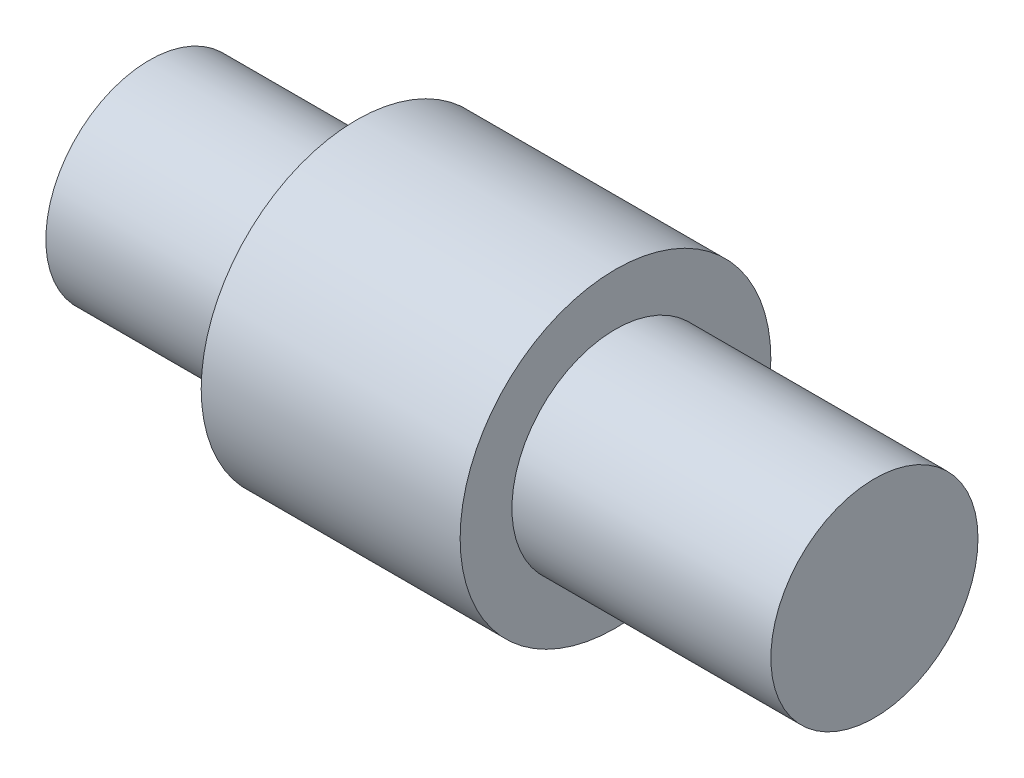
ISO-10303-21;
HEADER;
FILE_DESCRIPTION(('STEP AP214'),'2;1');
FILE_NAME('part.step','',(''),(''),'','','');
FILE_SCHEMA(('AUTOMOTIVE_DESIGN { 1 0 10303 214 1 1 1 1 }'));
ENDSEC;
DATA;
#1=APPLICATION_CONTEXT('core data for automotive mechanical design processes');
#2=APPLICATION_PROTOCOL_DEFINITION('international standard','automotive_design',2000,#1);
#3=PRODUCT_CONTEXT('',#1,'mechanical');
#4=PRODUCT('Part','Part','',(#3));
#5=PRODUCT_RELATED_PRODUCT_CATEGORY('part','',(#4));
#6=PRODUCT_DEFINITION_FORMATION('','',#4);
#7=PRODUCT_DEFINITION_CONTEXT('part definition',#1,'design');
#8=PRODUCT_DEFINITION('design','',#6,#7);
#9=PRODUCT_DEFINITION_SHAPE('','',#8);
#10=(LENGTH_UNIT() NAMED_UNIT(*) SI_UNIT(.MILLI.,.METRE.));
#11=(NAMED_UNIT(*) PLANE_ANGLE_UNIT() SI_UNIT($,.RADIAN.));
#12=(NAMED_UNIT(*) SI_UNIT($,.STERADIAN.) SOLID_ANGLE_UNIT());
#13=UNCERTAINTY_MEASURE_WITH_UNIT(LENGTH_MEASURE(1.E-05),#10,'distance_accuracy_value','');
#14=(GEOMETRIC_REPRESENTATION_CONTEXT(3) GLOBAL_UNCERTAINTY_ASSIGNED_CONTEXT((#13)) GLOBAL_UNIT_ASSIGNED_CONTEXT((#10,
#11,#12)) REPRESENTATION_CONTEXT('',''));
#15=CARTESIAN_POINT('',(0.,0.,0.));
#16=DIRECTION('',(0.,0.,1.));
#17=DIRECTION('',(1.,0.,0.));
#18=AXIS2_PLACEMENT_3D('',#15,#16,#17);
#19=CARTESIAN_POINT('',(5.,0.,0.));
#20=DIRECTION('',(-1.,0.,0.));
#21=DIRECTION('',(0.,0.,1.));
#22=AXIS2_PLACEMENT_3D('',#19,#20,#21);
#23=CYLINDRICAL_SURFACE('',#22,3.);
#24=CARTESIAN_POINT('',(5.,0.,0.));
#25=DIRECTION('',(1.,0.,0.));
#26=DIRECTION('',(0.,0.,-1.));
#27=AXIS2_PLACEMENT_3D('',#24,#25,#26);
#28=CIRCLE('',#27,3.);
#29=CARTESIAN_POINT('',(5.,0.,-3.));
#30=VERTEX_POINT('',#29);
#31=EDGE_CURVE('E38',#30,#30,#28,.T.);
#32=ORIENTED_EDGE('',*,*,#31,.F.);
#33=EDGE_LOOP('',(#32));
#34=FACE_BOUND('',#33,.T.);
#35=CARTESIAN_POINT('',(0.,0.,0.));
#36=DIRECTION('',(1.,0.,0.));
#37=DIRECTION('',(0.,0.,-1.));
#38=AXIS2_PLACEMENT_3D('',#35,#36,#37);
#39=CIRCLE('',#38,3.);
#40=CARTESIAN_POINT('',(0.,0.,-3.));
#41=VERTEX_POINT('',#40);
#42=EDGE_CURVE('E43',#41,#41,#39,.T.);
#43=ORIENTED_EDGE('',*,*,#42,.T.);
#44=EDGE_LOOP('',(#43));
#45=FACE_BOUND('',#44,.T.);
#46=ADVANCED_FACE('F31',(#34,#45),#23,.T.);
#47=CARTESIAN_POINT('',(5.,0.,0.));
#48=DIRECTION('',(1.,0.,0.));
#49=DIRECTION('',(0.,0.,-1.));
#50=AXIS2_PLACEMENT_3D('',#47,#48,#49);
#51=PLANE('',#50);
#52=CARTESIAN_POINT('',(5.,0.,0.));
#53=DIRECTION('',(1.,0.,0.));
#54=DIRECTION('',(0.,0.,-1.));
#55=AXIS2_PLACEMENT_3D('',#52,#53,#54);
#56=CIRCLE('',#55,2.);
#57=CARTESIAN_POINT('',(5.,0.,-2.));
#58=VERTEX_POINT('',#57);
#59=EDGE_CURVE('E10',#58,#58,#56,.T.);
#60=ORIENTED_EDGE('',*,*,#59,.F.);
#61=EDGE_LOOP('',(#60));
#62=FACE_BOUND('',#61,.T.);
#63=ORIENTED_EDGE('',*,*,#31,.T.);
#64=EDGE_LOOP('',(#63));
#65=FACE_BOUND('',#64,.T.);
#66=ADVANCED_FACE('F76',(#62,#65),#51,.T.);
#67=CARTESIAN_POINT('',(0.,0.,0.));
#68=DIRECTION('',(1.,0.,0.));
#69=DIRECTION('',(0.,0.,-1.));
#70=AXIS2_PLACEMENT_3D('',#67,#68,#69);
#71=PLANE('',#70);
#72=CARTESIAN_POINT('',(0.,0.,0.));
#73=DIRECTION('',(1.,0.,0.));
#74=DIRECTION('',(0.,0.,-1.));
#75=AXIS2_PLACEMENT_3D('',#72,#73,#74);
#76=CIRCLE('',#75,2.);
#77=CARTESIAN_POINT('',(0.,0.,-2.));
#78=VERTEX_POINT('',#77);
#79=EDGE_CURVE('E34',#78,#78,#76,.T.);
#80=ORIENTED_EDGE('',*,*,#79,.T.);
#81=EDGE_LOOP('',(#80));
#82=FACE_BOUND('',#81,.T.);
#83=ORIENTED_EDGE('',*,*,#42,.F.);
#84=EDGE_LOOP('',(#83));
#85=FACE_BOUND('',#84,.T.);
#86=ADVANCED_FACE('F81',(#82,#85),#71,.F.);
#87=CARTESIAN_POINT('',(-4.,0.,0.));
#88=DIRECTION('',(1.,0.,0.));
#89=DIRECTION('',(0.,0.,-1.));
#90=AXIS2_PLACEMENT_3D('',#87,#88,#89);
#91=PLANE('',#90);
#92=CARTESIAN_POINT('',(-4.,0.,0.));
#93=DIRECTION('',(1.,0.,0.));
#94=DIRECTION('',(0.,0.,-1.));
#95=AXIS2_PLACEMENT_3D('',#92,#93,#94);
#96=CIRCLE('',#95,2.);
#97=CARTESIAN_POINT('',(-4.,0.,-2.));
#98=VERTEX_POINT('',#97);
#99=EDGE_CURVE('E46',#98,#98,#96,.T.);
#100=ORIENTED_EDGE('',*,*,#99,.F.);
#101=EDGE_LOOP('',(#100));
#102=FACE_BOUND('',#101,.T.);
#103=ADVANCED_FACE('F72',(#102),#91,.F.);
#104=CARTESIAN_POINT('',(-4.,0.,0.));
#105=DIRECTION('',(1.,0.,0.));
#106=DIRECTION('',(0.,0.,-1.));
#107=AXIS2_PLACEMENT_3D('',#104,#105,#106);
#108=CYLINDRICAL_SURFACE('',#107,2.);
#109=ORIENTED_EDGE('',*,*,#99,.T.);
#110=EDGE_LOOP('',(#109));
#111=FACE_BOUND('',#110,.T.);
#112=ORIENTED_EDGE('',*,*,#79,.F.);
#113=EDGE_LOOP('',(#112));
#114=FACE_BOUND('',#113,.T.);
#115=ADVANCED_FACE('F65',(#111,#114),#108,.T.);
#116=ORIENTED_EDGE('',*,*,#59,.T.);
#117=EDGE_LOOP('',(#116));
#118=FACE_BOUND('',#117,.T.);
#119=CARTESIAN_POINT('',(10.,0.,0.));
#120=DIRECTION('',(1.,0.,0.));
#121=DIRECTION('',(0.,0.,-1.));
#122=AXIS2_PLACEMENT_3D('',#119,#120,#121);
#123=CIRCLE('',#122,2.);
#124=CARTESIAN_POINT('',(10.,0.,-2.));
#125=VERTEX_POINT('',#124);
#126=EDGE_CURVE('E55',#125,#125,#123,.T.);
#127=ORIENTED_EDGE('',*,*,#126,.F.);
#128=EDGE_LOOP('',(#127));
#129=FACE_BOUND('',#128,.T.);
#130=ADVANCED_FACE('F63',(#118,#129),#108,.T.);
#131=CARTESIAN_POINT('',(10.,0.,0.));
#132=DIRECTION('',(1.,0.,0.));
#133=DIRECTION('',(0.,0.,-1.));
#134=AXIS2_PLACEMENT_3D('',#131,#132,#133);
#135=PLANE('',#134);
#136=ORIENTED_EDGE('',*,*,#126,.T.);
#137=EDGE_LOOP('',(#136));
#138=FACE_BOUND('',#137,.T.);
#139=ADVANCED_FACE('F61',(#138),#135,.T.);
#140=CLOSED_SHELL('',(#46,#66,#86,#103,#115,#130,#139));
#141=MANIFOLD_SOLID_BREP('B2',#140);
#142=ADVANCED_BREP_SHAPE_REPRESENTATION('',(#18,#141),#14);
#143=SHAPE_DEFINITION_REPRESENTATION(#9,#142);
ENDSEC;
END-ISO-10303-21;
